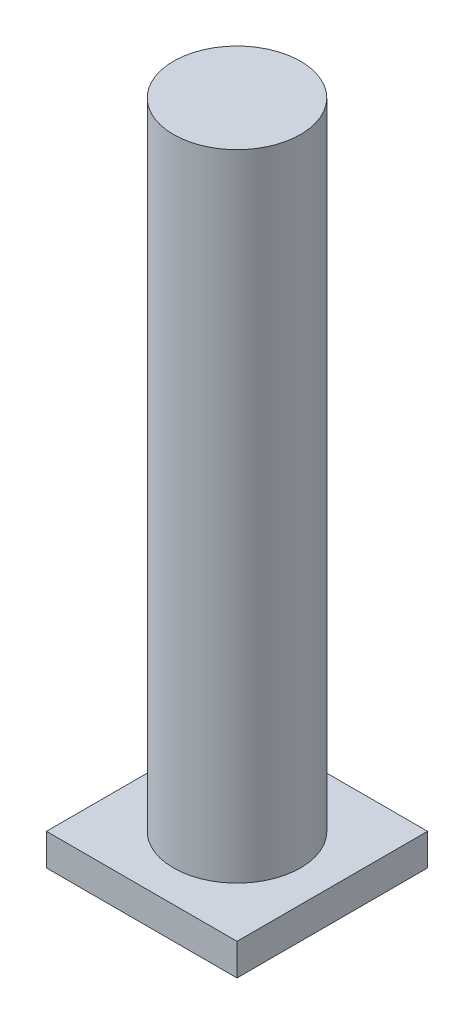
ISO-10303-21;
HEADER;
FILE_DESCRIPTION(('STEP AP214'),'2;1');
FILE_NAME('part.step','',(''),(''),'','','');
FILE_SCHEMA(('AUTOMOTIVE_DESIGN { 1 0 10303 214 1 1 1 1 }'));
ENDSEC;
DATA;
#1=APPLICATION_CONTEXT('core data for automotive mechanical design processes');
#2=APPLICATION_PROTOCOL_DEFINITION('international standard','automotive_design',2000,#1);
#3=PRODUCT_CONTEXT('',#1,'mechanical');
#4=PRODUCT('Part','Part','',(#3));
#5=PRODUCT_RELATED_PRODUCT_CATEGORY('part','',(#4));
#6=PRODUCT_DEFINITION_FORMATION('','',#4);
#7=PRODUCT_DEFINITION_CONTEXT('part definition',#1,'design');
#8=PRODUCT_DEFINITION('design','',#6,#7);
#9=PRODUCT_DEFINITION_SHAPE('','',#8);
#10=(LENGTH_UNIT() NAMED_UNIT(*) SI_UNIT(.MILLI.,.METRE.));
#11=(NAMED_UNIT(*) PLANE_ANGLE_UNIT() SI_UNIT($,.RADIAN.));
#12=(NAMED_UNIT(*) SI_UNIT($,.STERADIAN.) SOLID_ANGLE_UNIT());
#13=UNCERTAINTY_MEASURE_WITH_UNIT(LENGTH_MEASURE(1.E-05),#10,'distance_accuracy_value','');
#14=(GEOMETRIC_REPRESENTATION_CONTEXT(3) GLOBAL_UNCERTAINTY_ASSIGNED_CONTEXT((#13)) GLOBAL_UNIT_ASSIGNED_CONTEXT((#10,
#11,#12)) REPRESENTATION_CONTEXT('',''));
#15=CARTESIAN_POINT('',(0.,0.,0.));
#16=DIRECTION('',(0.,0.,1.));
#17=DIRECTION('',(1.,0.,0.));
#18=AXIS2_PLACEMENT_3D('',#15,#16,#17);
#19=CARTESIAN_POINT('',(0.,5.,0.));
#20=DIRECTION('',(0.,1.,0.));
#21=DIRECTION('',(0.,0.,1.));
#22=AXIS2_PLACEMENT_3D('',#19,#20,#21);
#23=PLANE('',#22);
#24=DIRECTION('',(0.,0.,1.));
#25=VECTOR('',#24,1.);
#26=CARTESIAN_POINT('',(-15.,5.,15.));
#27=LINE('',#26,#25);
#28=CARTESIAN_POINT('',(-15.,5.,-15.));
#29=VERTEX_POINT('',#28);
#30=CARTESIAN_POINT('',(-15.,5.,15.));
#31=VERTEX_POINT('',#30);
#32=EDGE_CURVE('E85',#29,#31,#27,.T.);
#33=ORIENTED_EDGE('',*,*,#32,.T.);
#34=DIRECTION('',(1.,0.,0.));
#35=VECTOR('',#34,1.);
#36=CARTESIAN_POINT('',(15.,5.,15.));
#37=LINE('',#36,#35);
#38=CARTESIAN_POINT('',(15.,5.,15.));
#39=VERTEX_POINT('',#38);
#40=EDGE_CURVE('E80',#31,#39,#37,.T.);
#41=ORIENTED_EDGE('',*,*,#40,.T.);
#42=DIRECTION('',(0.,0.,-1.));
#43=VECTOR('',#42,1.);
#44=CARTESIAN_POINT('',(15.,5.,15.));
#45=LINE('',#44,#43);
#46=CARTESIAN_POINT('',(15.,5.,-15.));
#47=VERTEX_POINT('',#46);
#48=EDGE_CURVE('E83',#39,#47,#45,.T.);
#49=ORIENTED_EDGE('',*,*,#48,.T.);
#50=DIRECTION('',(-1.,0.,0.));
#51=VECTOR('',#50,1.);
#52=CARTESIAN_POINT('',(15.,5.,-15.));
#53=LINE('',#52,#51);
#54=EDGE_CURVE('E50',#47,#29,#53,.T.);
#55=ORIENTED_EDGE('',*,*,#54,.T.);
#56=EDGE_LOOP('',(#33,#41,#49,#55));
#57=FACE_BOUND('',#56,.T.);
#58=CARTESIAN_POINT('',(0.,5.,0.));
#59=DIRECTION('',(0.,1.,0.));
#60=DIRECTION('',(0.,0.,1.));
#61=AXIS2_PLACEMENT_3D('',#58,#59,#60);
#62=CIRCLE('',#61,10.);
#63=CARTESIAN_POINT('',(0.,5.,10.));
#64=VERTEX_POINT('',#63);
#65=EDGE_CURVE('E111',#64,#64,#62,.T.);
#66=ORIENTED_EDGE('',*,*,#65,.F.);
#67=EDGE_LOOP('',(#66));
#68=FACE_BOUND('',#67,.T.);
#69=ADVANCED_FACE('F33',(#57,#68),#23,.T.);
#70=CARTESIAN_POINT('',(-15.,5.,15.));
#71=DIRECTION('',(1.,0.,0.));
#72=DIRECTION('',(0.,0.,-1.));
#73=AXIS2_PLACEMENT_3D('',#70,#71,#72);
#74=PLANE('',#73);
#75=DIRECTION('',(0.,0.,1.));
#76=VECTOR('',#75,1.);
#77=CARTESIAN_POINT('',(-15.,0.,15.));
#78=LINE('',#77,#76);
#79=CARTESIAN_POINT('',(-15.,0.,-15.));
#80=VERTEX_POINT('',#79);
#81=CARTESIAN_POINT('',(-15.,0.,15.));
#82=VERTEX_POINT('',#81);
#83=EDGE_CURVE('E97',#80,#82,#78,.T.);
#84=ORIENTED_EDGE('',*,*,#83,.T.);
#85=DIRECTION('',(0.,-1.,0.));
#86=VECTOR('',#85,1.);
#87=CARTESIAN_POINT('',(-15.,5.,15.));
#88=LINE('',#87,#86);
#89=EDGE_CURVE('E11',#31,#82,#88,.T.);
#90=ORIENTED_EDGE('',*,*,#89,.F.);
#91=ORIENTED_EDGE('',*,*,#32,.F.);
#92=DIRECTION('',(0.,-1.,0.));
#93=VECTOR('',#92,1.);
#94=CARTESIAN_POINT('',(-15.,5.,-15.));
#95=LINE('',#94,#93);
#96=EDGE_CURVE('E93',#29,#80,#95,.T.);
#97=ORIENTED_EDGE('',*,*,#96,.T.);
#98=EDGE_LOOP('',(#84,#90,#91,#97));
#99=FACE_BOUND('',#98,.T.);
#100=ADVANCED_FACE('F35',(#99),#74,.F.);
#101=CARTESIAN_POINT('',(15.,5.,15.));
#102=DIRECTION('',(0.,0.,-1.));
#103=DIRECTION('',(-1.,0.,0.));
#104=AXIS2_PLACEMENT_3D('',#101,#102,#103);
#105=PLANE('',#104);
#106=DIRECTION('',(1.,0.,0.));
#107=VECTOR('',#106,1.);
#108=CARTESIAN_POINT('',(15.,0.,15.));
#109=LINE('',#108,#107);
#110=CARTESIAN_POINT('',(15.,0.,15.));
#111=VERTEX_POINT('',#110);
#112=EDGE_CURVE('E89',#82,#111,#109,.T.);
#113=ORIENTED_EDGE('',*,*,#112,.T.);
#114=DIRECTION('',(0.,-1.,0.));
#115=VECTOR('',#114,1.);
#116=CARTESIAN_POINT('',(15.,5.,15.));
#117=LINE('',#116,#115);
#118=EDGE_CURVE('E42',#39,#111,#117,.T.);
#119=ORIENTED_EDGE('',*,*,#118,.F.);
#120=ORIENTED_EDGE('',*,*,#40,.F.);
#121=ORIENTED_EDGE('',*,*,#89,.T.);
#122=EDGE_LOOP('',(#113,#119,#120,#121));
#123=FACE_BOUND('',#122,.T.);
#124=ADVANCED_FACE('F88',(#123),#105,.F.);
#125=CARTESIAN_POINT('',(15.,5.,15.));
#126=DIRECTION('',(-1.,0.,0.));
#127=DIRECTION('',(0.,0.,1.));
#128=AXIS2_PLACEMENT_3D('',#125,#126,#127);
#129=PLANE('',#128);
#130=DIRECTION('',(0.,0.,-1.));
#131=VECTOR('',#130,1.);
#132=CARTESIAN_POINT('',(15.,0.,15.));
#133=LINE('',#132,#131);
#134=CARTESIAN_POINT('',(15.,0.,-15.));
#135=VERTEX_POINT('',#134);
#136=EDGE_CURVE('E67',#111,#135,#133,.T.);
#137=ORIENTED_EDGE('',*,*,#136,.T.);
#138=DIRECTION('',(0.,-1.,0.));
#139=VECTOR('',#138,1.);
#140=CARTESIAN_POINT('',(15.,5.,-15.));
#141=LINE('',#140,#139);
#142=EDGE_CURVE('E90',#47,#135,#141,.T.);
#143=ORIENTED_EDGE('',*,*,#142,.F.);
#144=ORIENTED_EDGE('',*,*,#48,.F.);
#145=ORIENTED_EDGE('',*,*,#118,.T.);
#146=EDGE_LOOP('',(#137,#143,#144,#145));
#147=FACE_BOUND('',#146,.T.);
#148=ADVANCED_FACE('F91',(#147),#129,.F.);
#149=CARTESIAN_POINT('',(15.,5.,-15.));
#150=DIRECTION('',(0.,0.,1.));
#151=DIRECTION('',(1.,0.,0.));
#152=AXIS2_PLACEMENT_3D('',#149,#150,#151);
#153=PLANE('',#152);
#154=DIRECTION('',(-1.,0.,0.));
#155=VECTOR('',#154,1.);
#156=CARTESIAN_POINT('',(15.,0.,-15.));
#157=LINE('',#156,#155);
#158=EDGE_CURVE('E73',#135,#80,#157,.T.);
#159=ORIENTED_EDGE('',*,*,#158,.T.);
#160=ORIENTED_EDGE('',*,*,#96,.F.);
#161=ORIENTED_EDGE('',*,*,#54,.F.);
#162=ORIENTED_EDGE('',*,*,#142,.T.);
#163=EDGE_LOOP('',(#159,#160,#161,#162));
#164=FACE_BOUND('',#163,.T.);
#165=ADVANCED_FACE('F105',(#164),#153,.F.);
#166=CARTESIAN_POINT('',(0.,0.,0.));
#167=DIRECTION('',(0.,1.,0.));
#168=DIRECTION('',(0.,0.,1.));
#169=AXIS2_PLACEMENT_3D('',#166,#167,#168);
#170=PLANE('',#169);
#171=ORIENTED_EDGE('',*,*,#83,.F.);
#172=ORIENTED_EDGE('',*,*,#158,.F.);
#173=ORIENTED_EDGE('',*,*,#136,.F.);
#174=ORIENTED_EDGE('',*,*,#112,.F.);
#175=EDGE_LOOP('',(#171,#172,#173,#174));
#176=FACE_BOUND('',#175,.T.);
#177=ADVANCED_FACE('F108',(#176),#170,.F.);
#178=CARTESIAN_POINT('',(0.,105.,0.));
#179=DIRECTION('',(0.,-1.,0.));
#180=DIRECTION('',(0.,0.,-1.));
#181=AXIS2_PLACEMENT_3D('',#178,#179,#180);
#182=CYLINDRICAL_SURFACE('',#181,10.);
#183=CARTESIAN_POINT('',(0.,105.,0.));
#184=DIRECTION('',(0.,1.,0.));
#185=DIRECTION('',(0.,0.,1.));
#186=AXIS2_PLACEMENT_3D('',#183,#184,#185);
#187=CIRCLE('',#186,10.);
#188=CARTESIAN_POINT('',(0.,105.,10.));
#189=VERTEX_POINT('',#188);
#190=EDGE_CURVE('E100',#189,#189,#187,.T.);
#191=ORIENTED_EDGE('',*,*,#190,.F.);
#192=EDGE_LOOP('',(#191));
#193=FACE_BOUND('',#192,.T.);
#194=ORIENTED_EDGE('',*,*,#65,.T.);
#195=EDGE_LOOP('',(#194));
#196=FACE_BOUND('',#195,.T.);
#197=ADVANCED_FACE('F119',(#193,#196),#182,.T.);
#198=CARTESIAN_POINT('',(0.,105.,0.));
#199=DIRECTION('',(0.,1.,0.));
#200=DIRECTION('',(0.,0.,1.));
#201=AXIS2_PLACEMENT_3D('',#198,#199,#200);
#202=PLANE('',#201);
#203=ORIENTED_EDGE('',*,*,#190,.T.);
#204=EDGE_LOOP('',(#203));
#205=FACE_BOUND('',#204,.T.);
#206=ADVANCED_FACE('F117',(#205),#202,.T.);
#207=CLOSED_SHELL('',(#69,#100,#124,#148,#165,#177,#197,#206));
#208=MANIFOLD_SOLID_BREP('B2',#207);
#209=ADVANCED_BREP_SHAPE_REPRESENTATION('',(#18,#208),#14);
#210=SHAPE_DEFINITION_REPRESENTATION(#9,#209);
ENDSEC;
END-ISO-10303-21;
